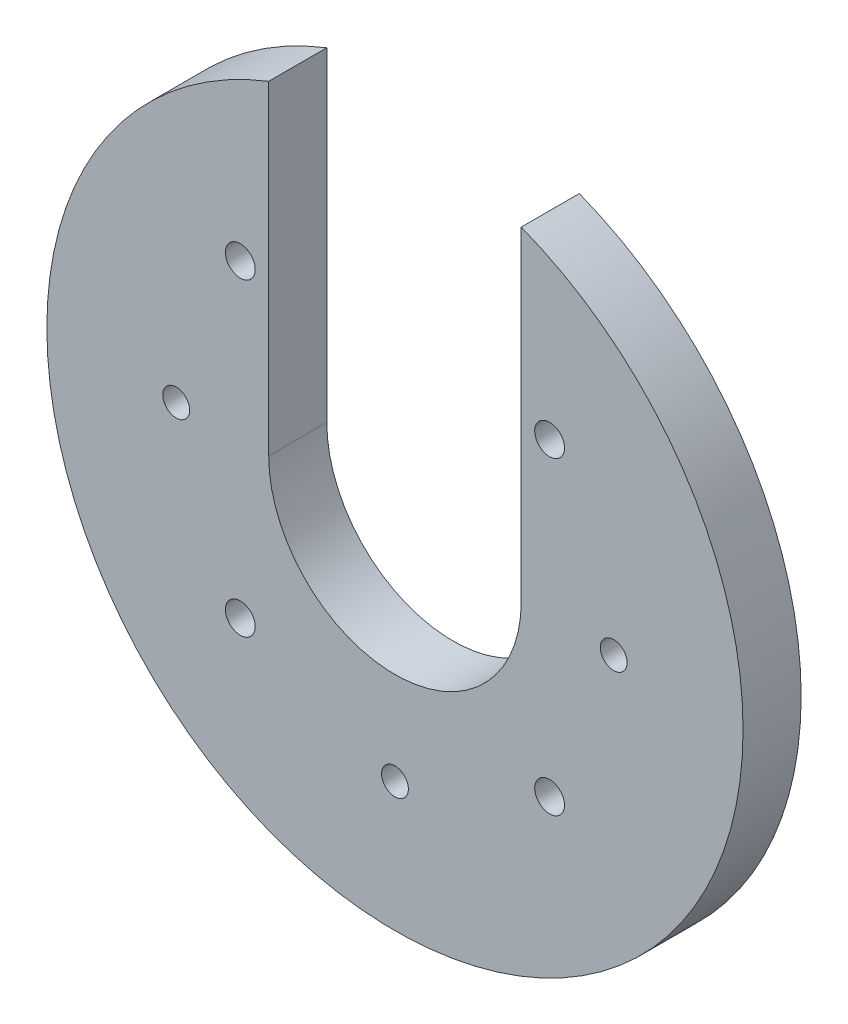
ISO-10303-21;
HEADER;
FILE_DESCRIPTION(('STEP AP214'),'2;1');
FILE_NAME('part.step','',(''),(''),'','','');
FILE_SCHEMA(('AUTOMOTIVE_DESIGN { 1 0 10303 214 1 1 1 1 }'));
ENDSEC;
DATA;
#1=APPLICATION_CONTEXT('core data for automotive mechanical design processes');
#2=APPLICATION_PROTOCOL_DEFINITION('international standard','automotive_design',2000,#1);
#3=PRODUCT_CONTEXT('',#1,'mechanical');
#4=PRODUCT('Part','Part','',(#3));
#5=PRODUCT_RELATED_PRODUCT_CATEGORY('part','',(#4));
#6=PRODUCT_DEFINITION_FORMATION('','',#4);
#7=PRODUCT_DEFINITION_CONTEXT('part definition',#1,'design');
#8=PRODUCT_DEFINITION('design','',#6,#7);
#9=PRODUCT_DEFINITION_SHAPE('','',#8);
#10=(LENGTH_UNIT() NAMED_UNIT(*) SI_UNIT(.MILLI.,.METRE.));
#11=(NAMED_UNIT(*) PLANE_ANGLE_UNIT() SI_UNIT($,.RADIAN.));
#12=(NAMED_UNIT(*) SI_UNIT($,.STERADIAN.) SOLID_ANGLE_UNIT());
#13=UNCERTAINTY_MEASURE_WITH_UNIT(LENGTH_MEASURE(1.E-05),#10,'distance_accuracy_value','');
#14=(GEOMETRIC_REPRESENTATION_CONTEXT(3) GLOBAL_UNCERTAINTY_ASSIGNED_CONTEXT((#13)) GLOBAL_UNIT_ASSIGNED_CONTEXT((#10,
#11,#12)) REPRESENTATION_CONTEXT('',''));
#15=CARTESIAN_POINT('',(0.,0.,0.));
#16=DIRECTION('',(0.,0.,1.));
#17=DIRECTION('',(1.,0.,0.));
#18=AXIS2_PLACEMENT_3D('',#15,#16,#17);
#19=CARTESIAN_POINT('',(0.,0.,5.842));
#20=DIRECTION('',(0.,0.,-1.));
#21=DIRECTION('',(-1.,0.,0.));
#22=AXIS2_PLACEMENT_3D('',#19,#20,#21);
#23=CYLINDRICAL_SURFACE('',#22,12.7);
#24=CARTESIAN_POINT('',(0.,0.,0.));
#25=DIRECTION('',(0.,0.,1.));
#26=DIRECTION('',(1.,0.,0.));
#27=AXIS2_PLACEMENT_3D('',#24,#25,#26);
#28=CIRCLE('',#27,12.7);
#29=CARTESIAN_POINT('',(-12.7,0.,0.));
#30=VERTEX_POINT('',#29);
#31=CARTESIAN_POINT('',(12.7,0.,0.));
#32=VERTEX_POINT('',#31);
#33=EDGE_CURVE('E108',#30,#32,#28,.T.);
#34=ORIENTED_EDGE('',*,*,#33,.F.);
#35=DIRECTION('',(0.,0.,-1.));
#36=VECTOR('',#35,1.);
#37=CARTESIAN_POINT('',(-12.7,0.,5.842));
#38=LINE('',#37,#36);
#39=CARTESIAN_POINT('',(-12.7,0.,5.842));
#40=VERTEX_POINT('',#39);
#41=EDGE_CURVE('E11',#40,#30,#38,.T.);
#42=ORIENTED_EDGE('',*,*,#41,.F.);
#43=CARTESIAN_POINT('',(0.,0.,5.842));
#44=DIRECTION('',(0.,0.,1.));
#45=DIRECTION('',(1.,0.,0.));
#46=AXIS2_PLACEMENT_3D('',#43,#44,#45);
#47=CIRCLE('',#46,12.7);
#48=CARTESIAN_POINT('',(12.7,0.,5.842));
#49=VERTEX_POINT('',#48);
#50=EDGE_CURVE('E92',#40,#49,#47,.T.);
#51=ORIENTED_EDGE('',*,*,#50,.T.);
#52=DIRECTION('',(0.,0.,-1.));
#53=VECTOR('',#52,1.);
#54=CARTESIAN_POINT('',(12.7,0.,5.842));
#55=LINE('',#54,#53);
#56=EDGE_CURVE('E54',#49,#32,#55,.T.);
#57=ORIENTED_EDGE('',*,*,#56,.T.);
#58=EDGE_LOOP('',(#34,#42,#51,#57));
#59=FACE_BOUND('',#58,.T.);
#60=ADVANCED_FACE('F37',(#59),#23,.F.);
#61=CARTESIAN_POINT('',(-12.7,0.,5.842));
#62=DIRECTION('',(-1.,0.,0.));
#63=DIRECTION('',(0.,0.,1.));
#64=AXIS2_PLACEMENT_3D('',#61,#62,#63);
#65=PLANE('',#64);
#66=DIRECTION('',(0.,1.,0.));
#67=VECTOR('',#66,1.);
#68=CARTESIAN_POINT('',(-12.7,0.,0.));
#69=LINE('',#68,#67);
#70=CARTESIAN_POINT('',(-12.7,32.6294834959121,0.));
#71=VERTEX_POINT('',#70);
#72=EDGE_CURVE('E97',#30,#71,#69,.T.);
#73=ORIENTED_EDGE('',*,*,#72,.T.);
#74=DIRECTION('',(0.,0.,-1.));
#75=VECTOR('',#74,1.);
#76=CARTESIAN_POINT('',(-12.7,32.6294834959121,5.842));
#77=LINE('',#76,#75);
#78=CARTESIAN_POINT('',(-12.7,32.6294834959121,5.842));
#79=VERTEX_POINT('',#78);
#80=EDGE_CURVE('E46',#79,#71,#77,.T.);
#81=ORIENTED_EDGE('',*,*,#80,.F.);
#82=DIRECTION('',(0.,1.,0.));
#83=VECTOR('',#82,1.);
#84=CARTESIAN_POINT('',(-12.7,0.,5.842));
#85=LINE('',#84,#83);
#86=EDGE_CURVE('E88',#40,#79,#85,.T.);
#87=ORIENTED_EDGE('',*,*,#86,.F.);
#88=ORIENTED_EDGE('',*,*,#41,.T.);
#89=EDGE_LOOP('',(#73,#81,#87,#88));
#90=FACE_BOUND('',#89,.T.);
#91=ADVANCED_FACE('F95',(#90),#65,.F.);
#92=CARTESIAN_POINT('',(0.,0.,5.842));
#93=DIRECTION('',(0.,0.,-1.));
#94=DIRECTION('',(-1.,0.,0.));
#95=AXIS2_PLACEMENT_3D('',#92,#93,#94);
#96=CYLINDRICAL_SURFACE('',#95,35.0139);
#97=CARTESIAN_POINT('',(0.,0.,0.));
#98=DIRECTION('',(0.,0.,1.));
#99=DIRECTION('',(1.,0.,0.));
#100=AXIS2_PLACEMENT_3D('',#97,#98,#99);
#101=CIRCLE('',#100,35.0139);
#102=CARTESIAN_POINT('',(12.7,32.6294834959121,0.));
#103=VERTEX_POINT('',#102);
#104=EDGE_CURVE('E105',#71,#103,#101,.T.);
#105=ORIENTED_EDGE('',*,*,#104,.T.);
#106=DIRECTION('',(0.,0.,-1.));
#107=VECTOR('',#106,1.);
#108=CARTESIAN_POINT('',(12.7,32.6294834959121,5.842));
#109=LINE('',#108,#107);
#110=CARTESIAN_POINT('',(12.7,32.6294834959121,5.842));
#111=VERTEX_POINT('',#110);
#112=EDGE_CURVE('E68',#111,#103,#109,.T.);
#113=ORIENTED_EDGE('',*,*,#112,.F.);
#114=CARTESIAN_POINT('',(0.,0.,5.842));
#115=DIRECTION('',(0.,0.,1.));
#116=DIRECTION('',(1.,0.,0.));
#117=AXIS2_PLACEMENT_3D('',#114,#115,#116);
#118=CIRCLE('',#117,35.0139);
#119=EDGE_CURVE('E80',#79,#111,#118,.T.);
#120=ORIENTED_EDGE('',*,*,#119,.F.);
#121=ORIENTED_EDGE('',*,*,#80,.T.);
#122=EDGE_LOOP('',(#105,#113,#120,#121));
#123=FACE_BOUND('',#122,.T.);
#124=ADVANCED_FACE('F82',(#123),#96,.T.);
#125=CARTESIAN_POINT('',(22.,0.,5.842));
#126=DIRECTION('',(0.,0.,-1.));
#127=DIRECTION('',(-1.,0.,0.));
#128=AXIS2_PLACEMENT_3D('',#125,#126,#127);
#129=CYLINDRICAL_SURFACE('',#128,1.35);
#130=CARTESIAN_POINT('',(22.,0.,5.842));
#131=DIRECTION('',(0.,0.,1.));
#132=DIRECTION('',(1.,0.,0.));
#133=AXIS2_PLACEMENT_3D('',#130,#131,#132);
#134=CIRCLE('',#133,1.35);
#135=CARTESIAN_POINT('',(23.35,0.,5.842));
#136=VERTEX_POINT('',#135);
#137=EDGE_CURVE('E122',#136,#136,#134,.T.);
#138=ORIENTED_EDGE('',*,*,#137,.T.);
#139=EDGE_LOOP('',(#138));
#140=FACE_BOUND('',#139,.T.);
#141=CARTESIAN_POINT('',(22.,0.,0.));
#142=DIRECTION('',(0.,0.,1.));
#143=DIRECTION('',(1.,0.,0.));
#144=AXIS2_PLACEMENT_3D('',#141,#142,#143);
#145=CIRCLE('',#144,1.35);
#146=CARTESIAN_POINT('',(23.35,0.,0.));
#147=VERTEX_POINT('',#146);
#148=EDGE_CURVE('E110',#147,#147,#145,.T.);
#149=ORIENTED_EDGE('',*,*,#148,.F.);
#150=EDGE_LOOP('',(#149));
#151=FACE_BOUND('',#150,.T.);
#152=ADVANCED_FACE('F180',(#140,#151),#129,.F.);
#153=CARTESIAN_POINT('',(0.,-22.,5.842));
#154=DIRECTION('',(0.,0.,-1.));
#155=DIRECTION('',(-1.,0.,0.));
#156=AXIS2_PLACEMENT_3D('',#153,#154,#155);
#157=CYLINDRICAL_SURFACE('',#156,1.35);
#158=CARTESIAN_POINT('',(0.,-22.,5.842));
#159=DIRECTION('',(0.,0.,1.));
#160=DIRECTION('',(1.,0.,0.));
#161=AXIS2_PLACEMENT_3D('',#158,#159,#160);
#162=CIRCLE('',#161,1.35);
#163=CARTESIAN_POINT('',(1.35,-22.,5.842));
#164=VERTEX_POINT('',#163);
#165=EDGE_CURVE('E125',#164,#164,#162,.T.);
#166=ORIENTED_EDGE('',*,*,#165,.T.);
#167=EDGE_LOOP('',(#166));
#168=FACE_BOUND('',#167,.T.);
#169=CARTESIAN_POINT('',(0.,-22.,0.));
#170=DIRECTION('',(0.,0.,1.));
#171=DIRECTION('',(1.,0.,0.));
#172=AXIS2_PLACEMENT_3D('',#169,#170,#171);
#173=CIRCLE('',#172,1.35);
#174=CARTESIAN_POINT('',(1.35,-22.,0.));
#175=VERTEX_POINT('',#174);
#176=EDGE_CURVE('E113',#175,#175,#173,.T.);
#177=ORIENTED_EDGE('',*,*,#176,.F.);
#178=EDGE_LOOP('',(#177));
#179=FACE_BOUND('',#178,.T.);
#180=ADVANCED_FACE('F183',(#168,#179),#157,.F.);
#181=CARTESIAN_POINT('',(-22.,0.,5.842));
#182=DIRECTION('',(0.,0.,-1.));
#183=DIRECTION('',(-1.,0.,0.));
#184=AXIS2_PLACEMENT_3D('',#181,#182,#183);
#185=CYLINDRICAL_SURFACE('',#184,1.35);
#186=CARTESIAN_POINT('',(-22.,0.,5.842));
#187=DIRECTION('',(0.,0.,1.));
#188=DIRECTION('',(1.,0.,0.));
#189=AXIS2_PLACEMENT_3D('',#186,#187,#188);
#190=CIRCLE('',#189,1.35);
#191=CARTESIAN_POINT('',(-20.65,0.,5.842));
#192=VERTEX_POINT('',#191);
#193=EDGE_CURVE('E104',#192,#192,#190,.T.);
#194=ORIENTED_EDGE('',*,*,#193,.T.);
#195=EDGE_LOOP('',(#194));
#196=FACE_BOUND('',#195,.T.);
#197=CARTESIAN_POINT('',(-22.,0.,0.));
#198=DIRECTION('',(0.,0.,1.));
#199=DIRECTION('',(1.,0.,0.));
#200=AXIS2_PLACEMENT_3D('',#197,#198,#199);
#201=CIRCLE('',#200,1.35);
#202=CARTESIAN_POINT('',(-20.65,0.,0.));
#203=VERTEX_POINT('',#202);
#204=EDGE_CURVE('E116',#203,#203,#201,.T.);
#205=ORIENTED_EDGE('',*,*,#204,.F.);
#206=EDGE_LOOP('',(#205));
#207=FACE_BOUND('',#206,.T.);
#208=ADVANCED_FACE('F39',(#196,#207),#185,.F.);
#209=CARTESIAN_POINT('',(12.7,0.,5.842));
#210=DIRECTION('',(-1.,0.,0.));
#211=DIRECTION('',(0.,0.,1.));
#212=AXIS2_PLACEMENT_3D('',#209,#210,#211);
#213=PLANE('',#212);
#214=DIRECTION('',(0.,1.,0.));
#215=VECTOR('',#214,1.);
#216=CARTESIAN_POINT('',(12.7,0.,0.));
#217=LINE('',#216,#215);
#218=EDGE_CURVE('E101',#32,#103,#217,.T.);
#219=ORIENTED_EDGE('',*,*,#218,.F.);
#220=ORIENTED_EDGE('',*,*,#56,.F.);
#221=DIRECTION('',(0.,1.,0.));
#222=VECTOR('',#221,1.);
#223=CARTESIAN_POINT('',(12.7,0.,5.842));
#224=LINE('',#223,#222);
#225=EDGE_CURVE('E87',#49,#111,#224,.T.);
#226=ORIENTED_EDGE('',*,*,#225,.T.);
#227=ORIENTED_EDGE('',*,*,#112,.T.);
#228=EDGE_LOOP('',(#219,#220,#226,#227));
#229=FACE_BOUND('',#228,.T.);
#230=ADVANCED_FACE('F166',(#229),#213,.T.);
#231=CARTESIAN_POINT('',(0.,0.,5.842));
#232=DIRECTION('',(0.,0.,1.));
#233=DIRECTION('',(1.,0.,0.));
#234=AXIS2_PLACEMENT_3D('',#231,#232,#233);
#235=PLANE('',#234);
#236=CARTESIAN_POINT('',(15.5563491861041,-15.556349186104,5.842));
#237=DIRECTION('',(0.,0.,1.));
#238=DIRECTION('',(1.,0.,0.));
#239=AXIS2_PLACEMENT_3D('',#236,#237,#238);
#240=CIRCLE('',#239,1.5);
#241=CARTESIAN_POINT('',(17.0563491861041,-15.556349186104,5.842));
#242=VERTEX_POINT('',#241);
#243=EDGE_CURVE('E148',#242,#242,#240,.T.);
#244=ORIENTED_EDGE('',*,*,#243,.F.);
#245=EDGE_LOOP('',(#244));
#246=FACE_BOUND('',#245,.T.);
#247=CARTESIAN_POINT('',(15.556349186104,15.5563491861041,5.842));
#248=DIRECTION('',(0.,0.,1.));
#249=DIRECTION('',(1.,0.,0.));
#250=AXIS2_PLACEMENT_3D('',#247,#248,#249);
#251=CIRCLE('',#250,1.5);
#252=CARTESIAN_POINT('',(17.056349186104,15.5563491861041,5.842));
#253=VERTEX_POINT('',#252);
#254=EDGE_CURVE('E142',#253,#253,#251,.T.);
#255=ORIENTED_EDGE('',*,*,#254,.F.);
#256=EDGE_LOOP('',(#255));
#257=FACE_BOUND('',#256,.T.);
#258=CARTESIAN_POINT('',(-15.5563491861041,15.556349186104,5.842));
#259=DIRECTION('',(0.,0.,1.));
#260=DIRECTION('',(1.,0.,0.));
#261=AXIS2_PLACEMENT_3D('',#258,#259,#260);
#262=CIRCLE('',#261,1.5);
#263=CARTESIAN_POINT('',(-14.0563491861041,15.556349186104,5.842));
#264=VERTEX_POINT('',#263);
#265=EDGE_CURVE('E136',#264,#264,#262,.T.);
#266=ORIENTED_EDGE('',*,*,#265,.F.);
#267=EDGE_LOOP('',(#266));
#268=FACE_BOUND('',#267,.T.);
#269=CARTESIAN_POINT('',(-15.556349186104,-15.5563491861041,5.842));
#270=DIRECTION('',(0.,0.,1.));
#271=DIRECTION('',(1.,0.,0.));
#272=AXIS2_PLACEMENT_3D('',#269,#270,#271);
#273=CIRCLE('',#272,1.50000000000001);
#274=CARTESIAN_POINT('',(-14.056349186104,-15.5563491861041,5.842));
#275=VERTEX_POINT('',#274);
#276=EDGE_CURVE('E130',#275,#275,#273,.T.);
#277=ORIENTED_EDGE('',*,*,#276,.F.);
#278=EDGE_LOOP('',(#277));
#279=FACE_BOUND('',#278,.T.);
#280=ORIENTED_EDGE('',*,*,#193,.F.);
#281=EDGE_LOOP('',(#280));
#282=FACE_BOUND('',#281,.T.);
#283=ORIENTED_EDGE('',*,*,#165,.F.);
#284=EDGE_LOOP('',(#283));
#285=FACE_BOUND('',#284,.T.);
#286=ORIENTED_EDGE('',*,*,#137,.F.);
#287=EDGE_LOOP('',(#286));
#288=FACE_BOUND('',#287,.T.);
#289=ORIENTED_EDGE('',*,*,#50,.F.);
#290=ORIENTED_EDGE('',*,*,#86,.T.);
#291=ORIENTED_EDGE('',*,*,#119,.T.);
#292=ORIENTED_EDGE('',*,*,#225,.F.);
#293=EDGE_LOOP('',(#289,#290,#291,#292));
#294=FACE_BOUND('',#293,.T.);
#295=ADVANCED_FACE('F91',(#246,#257,#268,#279,#282,#285,#288,#294),#235,.T.);
#296=CARTESIAN_POINT('',(0.,0.,0.));
#297=DIRECTION('',(0.,0.,1.));
#298=DIRECTION('',(1.,0.,0.));
#299=AXIS2_PLACEMENT_3D('',#296,#297,#298);
#300=PLANE('',#299);
#301=CARTESIAN_POINT('',(15.5563491861041,-15.556349186104,0.));
#302=DIRECTION('',(0.,0.,1.));
#303=DIRECTION('',(1.,0.,0.));
#304=AXIS2_PLACEMENT_3D('',#301,#302,#303);
#305=CIRCLE('',#304,1.5);
#306=CARTESIAN_POINT('',(17.0563491861041,-15.556349186104,0.));
#307=VERTEX_POINT('',#306);
#308=EDGE_CURVE('E145',#307,#307,#305,.T.);
#309=ORIENTED_EDGE('',*,*,#308,.T.);
#310=EDGE_LOOP('',(#309));
#311=FACE_BOUND('',#310,.T.);
#312=CARTESIAN_POINT('',(15.556349186104,15.5563491861041,0.));
#313=DIRECTION('',(0.,0.,1.));
#314=DIRECTION('',(1.,0.,0.));
#315=AXIS2_PLACEMENT_3D('',#312,#313,#314);
#316=CIRCLE('',#315,1.5);
#317=CARTESIAN_POINT('',(17.056349186104,15.5563491861041,0.));
#318=VERTEX_POINT('',#317);
#319=EDGE_CURVE('E139',#318,#318,#316,.T.);
#320=ORIENTED_EDGE('',*,*,#319,.T.);
#321=EDGE_LOOP('',(#320));
#322=FACE_BOUND('',#321,.T.);
#323=CARTESIAN_POINT('',(-15.5563491861041,15.556349186104,0.));
#324=DIRECTION('',(0.,0.,1.));
#325=DIRECTION('',(1.,0.,0.));
#326=AXIS2_PLACEMENT_3D('',#323,#324,#325);
#327=CIRCLE('',#326,1.5);
#328=CARTESIAN_POINT('',(-14.0563491861041,15.556349186104,0.));
#329=VERTEX_POINT('',#328);
#330=EDGE_CURVE('E133',#329,#329,#327,.T.);
#331=ORIENTED_EDGE('',*,*,#330,.T.);
#332=EDGE_LOOP('',(#331));
#333=FACE_BOUND('',#332,.T.);
#334=CARTESIAN_POINT('',(-15.556349186104,-15.5563491861041,0.));
#335=DIRECTION('',(0.,0.,1.));
#336=DIRECTION('',(1.,0.,0.));
#337=AXIS2_PLACEMENT_3D('',#334,#335,#336);
#338=CIRCLE('',#337,1.50000000000001);
#339=CARTESIAN_POINT('',(-14.056349186104,-15.5563491861041,0.));
#340=VERTEX_POINT('',#339);
#341=EDGE_CURVE('E119',#340,#340,#338,.T.);
#342=ORIENTED_EDGE('',*,*,#341,.T.);
#343=EDGE_LOOP('',(#342));
#344=FACE_BOUND('',#343,.T.);
#345=ORIENTED_EDGE('',*,*,#204,.T.);
#346=EDGE_LOOP('',(#345));
#347=FACE_BOUND('',#346,.T.);
#348=ORIENTED_EDGE('',*,*,#176,.T.);
#349=EDGE_LOOP('',(#348));
#350=FACE_BOUND('',#349,.T.);
#351=ORIENTED_EDGE('',*,*,#148,.T.);
#352=EDGE_LOOP('',(#351));
#353=FACE_BOUND('',#352,.T.);
#354=ORIENTED_EDGE('',*,*,#33,.T.);
#355=ORIENTED_EDGE('',*,*,#218,.T.);
#356=ORIENTED_EDGE('',*,*,#104,.F.);
#357=ORIENTED_EDGE('',*,*,#72,.F.);
#358=EDGE_LOOP('',(#354,#355,#356,#357));
#359=FACE_BOUND('',#358,.T.);
#360=ADVANCED_FACE('F154',(#311,#322,#333,#344,#347,#350,#353,#359),#300,.F.);
#361=CARTESIAN_POINT('',(-15.556349186104,-15.5563491861041,0.));
#362=DIRECTION('',(0.,0.,1.));
#363=DIRECTION('',(1.,0.,0.));
#364=AXIS2_PLACEMENT_3D('',#361,#362,#363);
#365=CYLINDRICAL_SURFACE('',#364,1.50000000000001);
#366=ORIENTED_EDGE('',*,*,#341,.F.);
#367=EDGE_LOOP('',(#366));
#368=FACE_BOUND('',#367,.T.);
#369=ORIENTED_EDGE('',*,*,#276,.T.);
#370=EDGE_LOOP('',(#369));
#371=FACE_BOUND('',#370,.T.);
#372=ADVANCED_FACE('F189',(#368,#371),#365,.F.);
#373=CARTESIAN_POINT('',(-15.5563491861041,15.556349186104,0.));
#374=DIRECTION('',(0.,0.,1.));
#375=DIRECTION('',(1.,0.,0.));
#376=AXIS2_PLACEMENT_3D('',#373,#374,#375);
#377=CYLINDRICAL_SURFACE('',#376,1.5);
#378=ORIENTED_EDGE('',*,*,#330,.F.);
#379=EDGE_LOOP('',(#378));
#380=FACE_BOUND('',#379,.T.);
#381=ORIENTED_EDGE('',*,*,#265,.T.);
#382=EDGE_LOOP('',(#381));
#383=FACE_BOUND('',#382,.T.);
#384=ADVANCED_FACE('F243',(#380,#383),#377,.F.);
#385=CARTESIAN_POINT('',(15.556349186104,15.5563491861041,0.));
#386=DIRECTION('',(0.,0.,1.));
#387=DIRECTION('',(1.,0.,0.));
#388=AXIS2_PLACEMENT_3D('',#385,#386,#387);
#389=CYLINDRICAL_SURFACE('',#388,1.5);
#390=ORIENTED_EDGE('',*,*,#319,.F.);
#391=EDGE_LOOP('',(#390));
#392=FACE_BOUND('',#391,.T.);
#393=ORIENTED_EDGE('',*,*,#254,.T.);
#394=EDGE_LOOP('',(#393));
#395=FACE_BOUND('',#394,.T.);
#396=ADVANCED_FACE('F160',(#392,#395),#389,.F.);
#397=CARTESIAN_POINT('',(15.5563491861041,-15.556349186104,0.));
#398=DIRECTION('',(0.,0.,1.));
#399=DIRECTION('',(1.,0.,0.));
#400=AXIS2_PLACEMENT_3D('',#397,#398,#399);
#401=CYLINDRICAL_SURFACE('',#400,1.5);
#402=ORIENTED_EDGE('',*,*,#308,.F.);
#403=EDGE_LOOP('',(#402));
#404=FACE_BOUND('',#403,.T.);
#405=ORIENTED_EDGE('',*,*,#243,.T.);
#406=EDGE_LOOP('',(#405));
#407=FACE_BOUND('',#406,.T.);
#408=ADVANCED_FACE('F157',(#404,#407),#401,.F.);
#409=CLOSED_SHELL('',(#60,#91,#124,#152,#180,#208,#230,#295,#360,#372,#384,#396,#408));
#410=MANIFOLD_SOLID_BREP('B2',#409);
#411=ADVANCED_BREP_SHAPE_REPRESENTATION('',(#18,#410),#14);
#412=SHAPE_DEFINITION_REPRESENTATION(#9,#411);
ENDSEC;
END-ISO-10303-21;
